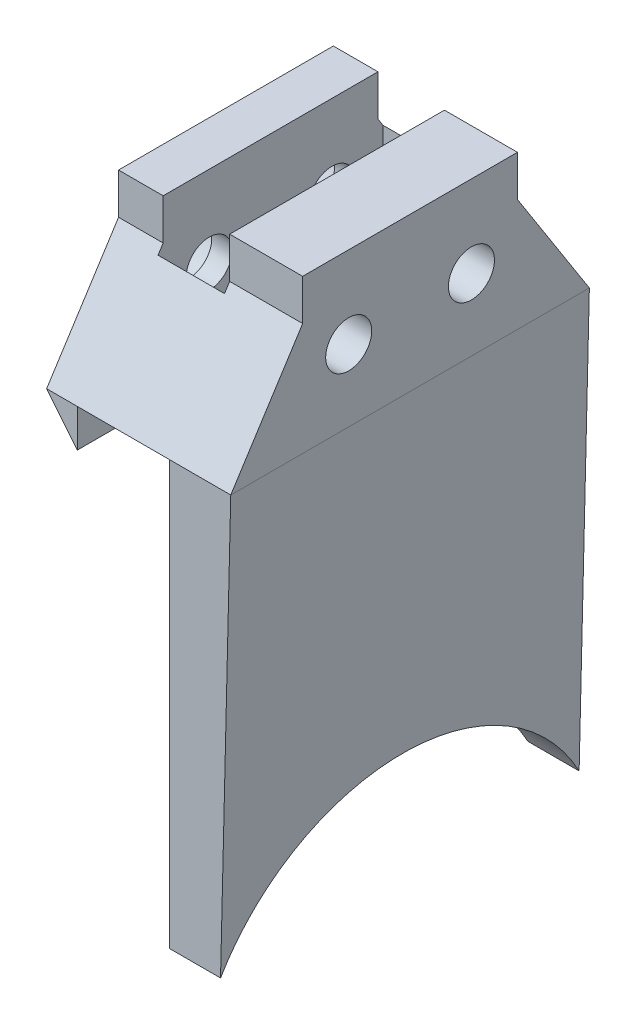
ISO-10303-21;
HEADER;
FILE_DESCRIPTION(('STEP AP214'),'2;1');
FILE_NAME('part.step','',(''),(''),'','','');
FILE_SCHEMA(('AUTOMOTIVE_DESIGN { 1 0 10303 214 1 1 1 1 }'));
ENDSEC;
DATA;
#1=APPLICATION_CONTEXT('core data for automotive mechanical design processes');
#2=APPLICATION_PROTOCOL_DEFINITION('international standard','automotive_design',2000,#1);
#3=PRODUCT_CONTEXT('',#1,'mechanical');
#4=PRODUCT('Part','Part','',(#3));
#5=PRODUCT_RELATED_PRODUCT_CATEGORY('part','',(#4));
#6=PRODUCT_DEFINITION_FORMATION('','',#4);
#7=PRODUCT_DEFINITION_CONTEXT('part definition',#1,'design');
#8=PRODUCT_DEFINITION('design','',#6,#7);
#9=PRODUCT_DEFINITION_SHAPE('','',#8);
#10=(LENGTH_UNIT() NAMED_UNIT(*) SI_UNIT(.MILLI.,.METRE.));
#11=(NAMED_UNIT(*) PLANE_ANGLE_UNIT() SI_UNIT($,.RADIAN.));
#12=(NAMED_UNIT(*) SI_UNIT($,.STERADIAN.) SOLID_ANGLE_UNIT());
#13=UNCERTAINTY_MEASURE_WITH_UNIT(LENGTH_MEASURE(1.E-05),#10,'distance_accuracy_value','');
#14=(GEOMETRIC_REPRESENTATION_CONTEXT(3) GLOBAL_UNCERTAINTY_ASSIGNED_CONTEXT((#13)) GLOBAL_UNIT_ASSIGNED_CONTEXT((#10,
#11,#12)) REPRESENTATION_CONTEXT('',''));
#15=CARTESIAN_POINT('',(0.,0.,0.));
#16=DIRECTION('',(0.,0.,1.));
#17=DIRECTION('',(1.,0.,0.));
#18=AXIS2_PLACEMENT_3D('',#15,#16,#17);
#19=CARTESIAN_POINT('',(6.,-7.5,35.0588586));
#20=DIRECTION('',(0.,1.,0.));
#21=DIRECTION('',(-1.,0.,0.));
#22=AXIS2_PLACEMENT_3D('',#19,#20,#21);
#23=PLANE('',#22);
#24=DIRECTION('',(-1.,0.,0.));
#25=VECTOR('',#24,1.);
#26=CARTESIAN_POINT('',(-1.6375,-7.5,6.5294293));
#27=LINE('',#26,#25);
#28=CARTESIAN_POINT('',(4.8625,-7.5,6.5294293));
#29=VERTEX_POINT('',#28);
#30=CARTESIAN_POINT('',(-1.6375,-7.5,6.5294293));
#31=VERTEX_POINT('',#30);
#32=EDGE_CURVE('E245',#29,#31,#27,.T.);
#33=ORIENTED_EDGE('',*,*,#32,.T.);
#34=DIRECTION('',(0.,0.,1.));
#35=VECTOR('',#34,1.);
#36=CARTESIAN_POINT('',(-1.6375,-7.5,6.5294293));
#37=LINE('',#36,#35);
#38=CARTESIAN_POINT('',(-1.6375,-7.5,28.5294293));
#39=VERTEX_POINT('',#38);
#40=EDGE_CURVE('E237',#31,#39,#37,.T.);
#41=ORIENTED_EDGE('',*,*,#40,.T.);
#42=DIRECTION('',(1.,0.,0.));
#43=VECTOR('',#42,1.);
#44=CARTESIAN_POINT('',(-1.6375,-7.5,28.5294293));
#45=LINE('',#44,#43);
#46=CARTESIAN_POINT('',(4.8625,-7.5,28.5294293));
#47=VERTEX_POINT('',#46);
#48=EDGE_CURVE('E240',#39,#47,#45,.T.);
#49=ORIENTED_EDGE('',*,*,#48,.T.);
#50=DIRECTION('',(0.,0.,-1.));
#51=VECTOR('',#50,1.);
#52=CARTESIAN_POINT('',(4.8625,-7.5,6.5294293));
#53=LINE('',#52,#51);
#54=EDGE_CURVE('E72',#47,#29,#53,.T.);
#55=ORIENTED_EDGE('',*,*,#54,.T.);
#56=EDGE_LOOP('',(#33,#41,#49,#55));
#57=FACE_BOUND('',#56,.T.);
#58=DIRECTION('',(0.,0.,-1.));
#59=VECTOR('',#58,1.);
#60=CARTESIAN_POINT('',(-3.,-7.49999999999995,35.0588586));
#61=LINE('',#60,#59);
#62=CARTESIAN_POINT('',(-3.,-7.5,35.0588586));
#63=VERTEX_POINT('',#62);
#64=CARTESIAN_POINT('',(-3.,-7.49999999999995,0.));
#65=VERTEX_POINT('',#64);
#66=EDGE_CURVE('E202',#63,#65,#61,.T.);
#67=ORIENTED_EDGE('',*,*,#66,.T.);
#68=DIRECTION('',(1.,0.,0.));
#69=VECTOR('',#68,1.);
#70=CARTESIAN_POINT('',(6.,-7.5,0.));
#71=LINE('',#70,#69);
#72=CARTESIAN_POINT('',(6.,-7.49999999999995,0.));
#73=VERTEX_POINT('',#72);
#74=EDGE_CURVE('E338',#65,#73,#71,.T.);
#75=ORIENTED_EDGE('',*,*,#74,.T.);
#76=DIRECTION('',(0.,0.,-1.));
#77=VECTOR('',#76,1.);
#78=CARTESIAN_POINT('',(6.,-7.5,35.0588586));
#79=LINE('',#78,#77);
#80=CARTESIAN_POINT('',(6.,-7.49999999999995,35.0588586));
#81=VERTEX_POINT('',#80);
#82=EDGE_CURVE('E346',#81,#73,#79,.T.);
#83=ORIENTED_EDGE('',*,*,#82,.F.);
#84=DIRECTION('',(1.,0.,0.));
#85=VECTOR('',#84,1.);
#86=CARTESIAN_POINT('',(6.,-7.5,35.0588586));
#87=LINE('',#86,#85);
#88=EDGE_CURVE('E64',#63,#81,#87,.T.);
#89=ORIENTED_EDGE('',*,*,#88,.F.);
#90=EDGE_LOOP('',(#67,#75,#83,#89));
#91=FACE_BOUND('',#90,.T.);
#92=ADVANCED_FACE('F47',(#57,#91),#23,.F.);
#93=CARTESIAN_POINT('',(12.,-0.499999999999999,23.5294293));
#94=DIRECTION('',(-1.,0.,0.));
#95=DIRECTION('',(0.,-1.,0.));
#96=AXIS2_PLACEMENT_3D('',#93,#94,#95);
#97=CYLINDRICAL_SURFACE('',#96,2.25);
#98=CARTESIAN_POINT('',(-1.6375,-0.5,23.5294293));
#99=DIRECTION('',(-1.,0.,0.));
#100=DIRECTION('',(0.,0.,1.));
#101=AXIS2_PLACEMENT_3D('',#98,#99,#100);
#102=CIRCLE('',#101,2.25);
#103=CARTESIAN_POINT('',(-1.6375,-0.5,25.7794293));
#104=VERTEX_POINT('',#103);
#105=EDGE_CURVE('E229',#104,#104,#102,.T.);
#106=ORIENTED_EDGE('',*,*,#105,.F.);
#107=EDGE_LOOP('',(#106));
#108=FACE_BOUND('',#107,.T.);
#109=CARTESIAN_POINT('',(-3.6375,-0.5,23.5294293));
#110=DIRECTION('',(-1.,0.,0.));
#111=DIRECTION('',(0.,-1.,0.));
#112=AXIS2_PLACEMENT_3D('',#109,#110,#111);
#113=CIRCLE('',#112,2.25);
#114=CARTESIAN_POINT('',(-3.6375,-2.75,23.5294293));
#115=VERTEX_POINT('',#114);
#116=EDGE_CURVE('E51',#115,#115,#113,.F.);
#117=ORIENTED_EDGE('',*,*,#116,.F.);
#118=EDGE_LOOP('',(#117));
#119=FACE_BOUND('',#118,.T.);
#120=ADVANCED_FACE('F370',(#108,#119),#97,.F.);
#121=CARTESIAN_POINT('',(12.,-0.499999999999999,11.5294293));
#122=DIRECTION('',(-1.,0.,0.));
#123=DIRECTION('',(0.,-1.,0.));
#124=AXIS2_PLACEMENT_3D('',#121,#122,#123);
#125=CYLINDRICAL_SURFACE('',#124,2.25);
#126=CARTESIAN_POINT('',(-1.6375,-0.5,11.5294293));
#127=DIRECTION('',(-1.,0.,0.));
#128=DIRECTION('',(0.,0.,1.));
#129=AXIS2_PLACEMENT_3D('',#126,#127,#128);
#130=CIRCLE('',#129,2.25);
#131=CARTESIAN_POINT('',(-1.6375,-0.5,13.7794293));
#132=VERTEX_POINT('',#131);
#133=EDGE_CURVE('E233',#132,#132,#130,.T.);
#134=ORIENTED_EDGE('',*,*,#133,.F.);
#135=EDGE_LOOP('',(#134));
#136=FACE_BOUND('',#135,.T.);
#137=CARTESIAN_POINT('',(-3.6375,-0.5,11.5294293));
#138=DIRECTION('',(-1.,0.,0.));
#139=DIRECTION('',(0.,-1.,0.));
#140=AXIS2_PLACEMENT_3D('',#137,#138,#139);
#141=CIRCLE('',#140,2.25);
#142=CARTESIAN_POINT('',(-3.6375,-2.75,11.5294293));
#143=VERTEX_POINT('',#142);
#144=EDGE_CURVE('E213',#143,#143,#141,.F.);
#145=ORIENTED_EDGE('',*,*,#144,.F.);
#146=EDGE_LOOP('',(#145));
#147=FACE_BOUND('',#146,.T.);
#148=ADVANCED_FACE('F372',(#136,#147),#125,.F.);
#149=CARTESIAN_POINT('',(6.,7.5,35.0588586));
#150=DIRECTION('',(0.,-1.,0.));
#151=DIRECTION('',(1.,0.,0.));
#152=AXIS2_PLACEMENT_3D('',#149,#150,#151);
#153=PLANE('',#152);
#154=DIRECTION('',(-1.,0.,0.));
#155=VECTOR('',#154,1.);
#156=CARTESIAN_POINT('',(12.,7.49999999999995,28.0294293));
#157=LINE('',#156,#155);
#158=CARTESIAN_POINT('',(-1.6375,7.5,28.0294293));
#159=VERTEX_POINT('',#158);
#160=CARTESIAN_POINT('',(-6.,7.49999999999995,28.0294293));
#161=VERTEX_POINT('',#160);
#162=EDGE_CURVE('E313',#159,#161,#157,.T.);
#163=ORIENTED_EDGE('',*,*,#162,.F.);
#164=DIRECTION('',(0.,0.,1.));
#165=VECTOR('',#164,1.);
#166=CARTESIAN_POINT('',(-1.6375,7.5,6.5294293));
#167=LINE('',#166,#165);
#168=CARTESIAN_POINT('',(-1.6375,7.5,7.0294293));
#169=VERTEX_POINT('',#168);
#170=EDGE_CURVE('E236',#169,#159,#167,.T.);
#171=ORIENTED_EDGE('',*,*,#170,.F.);
#172=DIRECTION('',(-1.,0.,0.));
#173=VECTOR('',#172,1.);
#174=CARTESIAN_POINT('',(12.,7.49999999999995,7.0294293));
#175=LINE('',#174,#173);
#176=CARTESIAN_POINT('',(-6.,7.5,7.0294293));
#177=VERTEX_POINT('',#176);
#178=EDGE_CURVE('E285',#169,#177,#175,.T.);
#179=ORIENTED_EDGE('',*,*,#178,.T.);
#180=DIRECTION('',(0.,0.,-1.));
#181=VECTOR('',#180,1.);
#182=CARTESIAN_POINT('',(-6.,7.5,35.0588586));
#183=LINE('',#182,#181);
#184=EDGE_CURVE('E340',#161,#177,#183,.T.);
#185=ORIENTED_EDGE('',*,*,#184,.F.);
#186=EDGE_LOOP('',(#163,#171,#179,#185));
#187=FACE_BOUND('',#186,.T.);
#188=ADVANCED_FACE('F379',(#187),#153,.F.);
#189=CARTESIAN_POINT('',(12.,7.49999999999995,28.0294293));
#190=DIRECTION('',(0.,0.,1.));
#191=DIRECTION('',(0.,-1.,0.));
#192=AXIS2_PLACEMENT_3D('',#189,#190,#191);
#193=PLANE('',#192);
#194=DIRECTION('',(0.,-1.,0.));
#195=VECTOR('',#194,1.);
#196=CARTESIAN_POINT('',(-1.6375,7.49999999999995,28.0294293));
#197=LINE('',#196,#195);
#198=CARTESIAN_POINT('',(-1.6375,3.49999999999995,28.0294293));
#199=VERTEX_POINT('',#198);
#200=EDGE_CURVE('E271',#159,#199,#197,.T.);
#201=ORIENTED_EDGE('',*,*,#200,.F.);
#202=ORIENTED_EDGE('',*,*,#162,.T.);
#203=DIRECTION('',(0.,1.,0.));
#204=VECTOR('',#203,1.);
#205=CARTESIAN_POINT('',(-6.,7.49999999999995,28.0294293));
#206=LINE('',#205,#204);
#207=CARTESIAN_POINT('',(-6.,3.49999999999995,28.0294293));
#208=VERTEX_POINT('',#207);
#209=EDGE_CURVE('E273',#208,#161,#206,.T.);
#210=ORIENTED_EDGE('',*,*,#209,.F.);
#211=DIRECTION('',(-1.,0.,0.));
#212=VECTOR('',#211,1.);
#213=CARTESIAN_POINT('',(12.,3.49999999999995,28.0294293));
#214=LINE('',#213,#212);
#215=EDGE_CURVE('E306',#199,#208,#214,.T.);
#216=ORIENTED_EDGE('',*,*,#215,.F.);
#217=EDGE_LOOP('',(#201,#202,#210,#216));
#218=FACE_BOUND('',#217,.T.);
#219=ADVANCED_FACE('F478',(#218),#193,.T.);
#220=CARTESIAN_POINT('',(12.,7.49999999999995,7.0294293));
#221=DIRECTION('',(0.,0.,-1.));
#222=DIRECTION('',(0.,1.,0.));
#223=AXIS2_PLACEMENT_3D('',#220,#221,#222);
#224=PLANE('',#223);
#225=DIRECTION('',(0.,1.,0.));
#226=VECTOR('',#225,1.);
#227=CARTESIAN_POINT('',(-1.6375,7.49999999999995,7.0294293));
#228=LINE('',#227,#226);
#229=CARTESIAN_POINT('',(-1.6375,3.49999999999995,7.0294293));
#230=VERTEX_POINT('',#229);
#231=EDGE_CURVE('E267',#230,#169,#228,.T.);
#232=ORIENTED_EDGE('',*,*,#231,.F.);
#233=DIRECTION('',(-1.,0.,0.));
#234=VECTOR('',#233,1.);
#235=CARTESIAN_POINT('',(12.,3.49999999999995,7.0294293));
#236=LINE('',#235,#234);
#237=CARTESIAN_POINT('',(-6.,3.49999999999995,7.0294293));
#238=VERTEX_POINT('',#237);
#239=EDGE_CURVE('E292',#230,#238,#236,.T.);
#240=ORIENTED_EDGE('',*,*,#239,.T.);
#241=DIRECTION('',(0.,-1.,0.));
#242=VECTOR('',#241,1.);
#243=CARTESIAN_POINT('',(-6.,7.49999999999995,7.0294293));
#244=LINE('',#243,#242);
#245=EDGE_CURVE('E274',#177,#238,#244,.T.);
#246=ORIENTED_EDGE('',*,*,#245,.F.);
#247=ORIENTED_EDGE('',*,*,#178,.F.);
#248=EDGE_LOOP('',(#232,#240,#246,#247));
#249=FACE_BOUND('',#248,.T.);
#250=ADVANCED_FACE('F467',(#249),#224,.T.);
#251=CARTESIAN_POINT('',(0.,0.,35.0588586));
#252=DIRECTION('',(0.,0.,-1.));
#253=DIRECTION('',(-1.,0.,0.));
#254=AXIS2_PLACEMENT_3D('',#251,#252,#253);
#255=PLANE('',#254);
#256=DIRECTION('',(-1.,0.,0.));
#257=VECTOR('',#256,1.);
#258=CARTESIAN_POINT('',(12.,-7.49999999999995,35.0588586));
#259=LINE('',#258,#257);
#260=CARTESIAN_POINT('',(12.,-7.49999999999995,35.0588586));
#261=VERTEX_POINT('',#260);
#262=EDGE_CURVE('E310',#261,#81,#259,.T.);
#263=ORIENTED_EDGE('',*,*,#262,.T.);
#264=DIRECTION('',(0.,-1.,0.));
#265=VECTOR('',#264,1.);
#266=CARTESIAN_POINT('',(6.,7.5,35.0588586));
#267=LINE('',#266,#265);
#268=CARTESIAN_POINT('',(6.00000000000001,-48.8959251,35.0588586));
#269=VERTEX_POINT('',#268);
#270=EDGE_CURVE('E330',#81,#269,#267,.T.);
#271=ORIENTED_EDGE('',*,*,#270,.T.);
#272=DIRECTION('',(-1.,0.,0.));
#273=VECTOR('',#272,1.);
#274=CARTESIAN_POINT('',(12.,-48.8959251,35.0588586));
#275=LINE('',#274,#273);
#276=CARTESIAN_POINT('',(11.,-48.8959251,35.0588586));
#277=VERTEX_POINT('',#276);
#278=EDGE_CURVE('E336',#277,#269,#275,.T.);
#279=ORIENTED_EDGE('',*,*,#278,.F.);
#280=DIRECTION('',(-0.0241499216576646,-0.999708348111552,0.));
#281=VECTOR('',#280,1.);
#282=CARTESIAN_POINT('',(12.1740729625627,-0.294088679819423,35.0588586));
#283=LINE('',#282,#281);
#284=EDGE_CURVE('E318',#261,#277,#283,.T.);
#285=ORIENTED_EDGE('',*,*,#284,.F.);
#286=EDGE_LOOP('',(#263,#271,#279,#285));
#287=FACE_BOUND('',#286,.T.);
#288=ADVANCED_FACE('F442',(#287),#255,.F.);
#289=CARTESIAN_POINT('',(0.,0.,0.));
#290=DIRECTION('',(0.,0.,-1.));
#291=DIRECTION('',(-1.,0.,0.));
#292=AXIS2_PLACEMENT_3D('',#289,#290,#291);
#293=PLANE('',#292);
#294=DIRECTION('',(0.,1.,0.));
#295=VECTOR('',#294,1.);
#296=CARTESIAN_POINT('',(6.,7.5,0.));
#297=LINE('',#296,#295);
#298=CARTESIAN_POINT('',(6.00000000000001,-48.8959251,0.));
#299=VERTEX_POINT('',#298);
#300=EDGE_CURVE('E322',#299,#73,#297,.T.);
#301=ORIENTED_EDGE('',*,*,#300,.T.);
#302=DIRECTION('',(-1.,0.,0.));
#303=VECTOR('',#302,1.);
#304=CARTESIAN_POINT('',(12.,-7.49999999999995,0.));
#305=LINE('',#304,#303);
#306=CARTESIAN_POINT('',(12.,-7.49999999999995,0.));
#307=VERTEX_POINT('',#306);
#308=EDGE_CURVE('E289',#307,#73,#305,.T.);
#309=ORIENTED_EDGE('',*,*,#308,.F.);
#310=DIRECTION('',(-0.0241499216576646,-0.999708348111552,0.));
#311=VECTOR('',#310,1.);
#312=CARTESIAN_POINT('',(12.1740729625627,-0.294088679819423,0.));
#313=LINE('',#312,#311);
#314=CARTESIAN_POINT('',(11.,-48.8959251,0.));
#315=VERTEX_POINT('',#314);
#316=EDGE_CURVE('E296',#307,#315,#313,.T.);
#317=ORIENTED_EDGE('',*,*,#316,.T.);
#318=DIRECTION('',(-1.,0.,0.));
#319=VECTOR('',#318,1.);
#320=CARTESIAN_POINT('',(12.,-48.8959251,0.));
#321=LINE('',#320,#319);
#322=EDGE_CURVE('E326',#315,#299,#321,.T.);
#323=ORIENTED_EDGE('',*,*,#322,.T.);
#324=EDGE_LOOP('',(#301,#309,#317,#323));
#325=FACE_BOUND('',#324,.T.);
#326=ADVANCED_FACE('F457',(#325),#293,.T.);
#327=CARTESIAN_POINT('',(12.,-58.5250012974502,17.5294293));
#328=DIRECTION('',(1.,0.,0.));
#329=DIRECTION('',(0.,1.,0.));
#330=AXIS2_PLACEMENT_3D('',#327,#328,#329);
#331=PLANE('',#330);
#332=CARTESIAN_POINT('',(12.,-0.499999999999999,11.5294293));
#333=DIRECTION('',(-1.,0.,0.));
#334=DIRECTION('',(0.,-1.,0.));
#335=AXIS2_PLACEMENT_3D('',#332,#333,#334);
#336=CIRCLE('',#335,2.25);
#337=CARTESIAN_POINT('',(12.,-2.75,11.5294293));
#338=VERTEX_POINT('',#337);
#339=EDGE_CURVE('E222',#338,#338,#336,.T.);
#340=ORIENTED_EDGE('',*,*,#339,.T.);
#341=EDGE_LOOP('',(#340));
#342=FACE_BOUND('',#341,.T.);
#343=CARTESIAN_POINT('',(12.,-0.499999999999999,23.5294293));
#344=DIRECTION('',(-1.,0.,0.));
#345=DIRECTION('',(0.,-1.,0.));
#346=AXIS2_PLACEMENT_3D('',#343,#344,#345);
#347=CIRCLE('',#346,2.25);
#348=CARTESIAN_POINT('',(12.,-2.75,23.5294293));
#349=VERTEX_POINT('',#348);
#350=EDGE_CURVE('E226',#349,#349,#347,.T.);
#351=ORIENTED_EDGE('',*,*,#350,.T.);
#352=EDGE_LOOP('',(#351));
#353=FACE_BOUND('',#352,.T.);
#354=DIRECTION('',(0.,-0.842638856504142,-0.538479115202615));
#355=VECTOR('',#354,1.);
#356=CARTESIAN_POINT('',(12.,3.49999999999995,7.0294293));
#357=LINE('',#356,#355);
#358=CARTESIAN_POINT('',(12.,3.49999999999995,7.0294293));
#359=VERTEX_POINT('',#358);
#360=EDGE_CURVE('E283',#359,#307,#357,.T.);
#361=ORIENTED_EDGE('',*,*,#360,.F.);
#362=DIRECTION('',(0.,-1.,0.));
#363=VECTOR('',#362,1.);
#364=CARTESIAN_POINT('',(12.,7.49999999999995,7.0294293));
#365=LINE('',#364,#363);
#366=CARTESIAN_POINT('',(12.,7.49999999999995,7.0294293));
#367=VERTEX_POINT('',#366);
#368=EDGE_CURVE('E281',#367,#359,#365,.T.);
#369=ORIENTED_EDGE('',*,*,#368,.F.);
#370=DIRECTION('',(0.,0.,1.));
#371=VECTOR('',#370,1.);
#372=CARTESIAN_POINT('',(12.,7.5,0.));
#373=LINE('',#372,#371);
#374=CARTESIAN_POINT('',(12.,7.5,28.0294293));
#375=VERTEX_POINT('',#374);
#376=EDGE_CURVE('E323',#367,#375,#373,.T.);
#377=ORIENTED_EDGE('',*,*,#376,.T.);
#378=DIRECTION('',(0.,1.,0.));
#379=VECTOR('',#378,1.);
#380=CARTESIAN_POINT('',(12.,7.49999999999995,28.0294293));
#381=LINE('',#380,#379);
#382=CARTESIAN_POINT('',(12.,3.49999999999995,28.0294293));
#383=VERTEX_POINT('',#382);
#384=EDGE_CURVE('E302',#383,#375,#381,.T.);
#385=ORIENTED_EDGE('',*,*,#384,.F.);
#386=DIRECTION('',(0.,0.842638856504142,-0.538479115202615));
#387=VECTOR('',#386,1.);
#388=CARTESIAN_POINT('',(12.,3.49999999999995,28.0294293));
#389=LINE('',#388,#387);
#390=EDGE_CURVE('E304',#261,#383,#389,.T.);
#391=ORIENTED_EDGE('',*,*,#390,.F.);
#392=DIRECTION('',(0.,0.,-1.));
#393=VECTOR('',#392,1.);
#394=CARTESIAN_POINT('',(12.,-7.50000000000031,17.5294293));
#395=LINE('',#394,#393);
#396=EDGE_CURVE('E351',#261,#307,#395,.T.);
#397=ORIENTED_EDGE('',*,*,#396,.T.);
#398=EDGE_LOOP('',(#361,#369,#377,#385,#391,#397));
#399=FACE_BOUND('',#398,.T.);
#400=ADVANCED_FACE('F420',(#342,#353,#399),#331,.T.);
#401=CARTESIAN_POINT('',(-6.,7.5,35.0588586));
#402=DIRECTION('',(1.,0.,0.));
#403=DIRECTION('',(0.,1.,0.));
#404=AXIS2_PLACEMENT_3D('',#401,#402,#403);
#405=PLANE('',#404);
#406=CARTESIAN_POINT('',(-6.,-0.500000000000001,11.5294293));
#407=DIRECTION('',(-1.,0.,0.));
#408=DIRECTION('',(0.,-1.,0.));
#409=AXIS2_PLACEMENT_3D('',#406,#407,#408);
#410=CIRCLE('',#409,3.75);
#411=CARTESIAN_POINT('',(-6.,-4.25,11.5294293));
#412=VERTEX_POINT('',#411);
#413=EDGE_CURVE('E214',#412,#412,#410,.T.);
#414=ORIENTED_EDGE('',*,*,#413,.F.);
#415=EDGE_LOOP('',(#414));
#416=FACE_BOUND('',#415,.T.);
#417=CARTESIAN_POINT('',(-6.,-0.500000000000001,23.5294293));
#418=DIRECTION('',(-1.,0.,0.));
#419=DIRECTION('',(0.,-1.,0.));
#420=AXIS2_PLACEMENT_3D('',#417,#418,#419);
#421=CIRCLE('',#420,3.75);
#422=CARTESIAN_POINT('',(-6.,-4.25,23.5294293));
#423=VERTEX_POINT('',#422);
#424=EDGE_CURVE('E201',#423,#423,#421,.T.);
#425=ORIENTED_EDGE('',*,*,#424,.F.);
#426=EDGE_LOOP('',(#425));
#427=FACE_BOUND('',#426,.T.);
#428=ORIENTED_EDGE('',*,*,#245,.T.);
#429=DIRECTION('',(0.,-0.842638856504142,-0.538479115202615));
#430=VECTOR('',#429,1.);
#431=CARTESIAN_POINT('',(-6.,3.49999999999995,7.0294293));
#432=LINE('',#431,#430);
#433=CARTESIAN_POINT('',(-6.,-7.49999999999995,0.));
#434=VERTEX_POINT('',#433);
#435=EDGE_CURVE('E277',#238,#434,#432,.T.);
#436=ORIENTED_EDGE('',*,*,#435,.T.);
#437=DIRECTION('',(0.,0.,-1.));
#438=VECTOR('',#437,1.);
#439=CARTESIAN_POINT('',(-6.,-7.5,35.0588586));
#440=LINE('',#439,#438);
#441=CARTESIAN_POINT('',(-6.,-7.49999999999995,35.0588586));
#442=VERTEX_POINT('',#441);
#443=EDGE_CURVE('E349',#442,#434,#440,.T.);
#444=ORIENTED_EDGE('',*,*,#443,.F.);
#445=DIRECTION('',(0.,0.842638856504142,-0.538479115202615));
#446=VECTOR('',#445,1.);
#447=CARTESIAN_POINT('',(-6.,3.49999999999995,28.0294293));
#448=LINE('',#447,#446);
#449=EDGE_CURVE('E299',#442,#208,#448,.T.);
#450=ORIENTED_EDGE('',*,*,#449,.T.);
#451=ORIENTED_EDGE('',*,*,#209,.T.);
#452=ORIENTED_EDGE('',*,*,#184,.T.);
#453=EDGE_LOOP('',(#428,#436,#444,#450,#451,#452));
#454=FACE_BOUND('',#453,.T.);
#455=ADVANCED_FACE('F49',(#416,#427,#454),#405,.F.);
#456=CARTESIAN_POINT('',(4.8625,7.5,7.0294293));
#457=VERTEX_POINT('',#456);
#458=EDGE_CURVE('E286',#367,#457,#175,.T.);
#459=ORIENTED_EDGE('',*,*,#458,.T.);
#460=DIRECTION('',(0.,0.,-1.));
#461=VECTOR('',#460,1.);
#462=CARTESIAN_POINT('',(4.8625,7.5,6.5294293));
#463=LINE('',#462,#461);
#464=CARTESIAN_POINT('',(4.8625,7.5,28.0294293));
#465=VERTEX_POINT('',#464);
#466=EDGE_CURVE('E241',#465,#457,#463,.T.);
#467=ORIENTED_EDGE('',*,*,#466,.F.);
#468=EDGE_CURVE('E278',#375,#465,#157,.T.);
#469=ORIENTED_EDGE('',*,*,#468,.F.);
#470=ORIENTED_EDGE('',*,*,#376,.F.);
#471=EDGE_LOOP('',(#459,#467,#469,#470));
#472=FACE_BOUND('',#471,.T.);
#473=ADVANCED_FACE('F413',(#472),#153,.F.);
#474=CARTESIAN_POINT('',(12.,-58.5250012974502,17.5294293));
#475=DIRECTION('',(-1.,0.,0.));
#476=DIRECTION('',(0.,-1.,0.));
#477=AXIS2_PLACEMENT_3D('',#474,#475,#476);
#478=CYLINDRICAL_SURFACE('',#477,20.);
#479=CARTESIAN_POINT('',(10.7673907232611,-58.5250012974502,17.5294293));
#480=DIRECTION('',(0.999708348111552,-0.0241499216576646,0.));
#481=DIRECTION('',(-0.0241499216576646,-0.999708348111552,0.));
#482=AXIS2_PLACEMENT_3D('',#479,#480,#481);
#483=ELLIPSE('',#482,20.0058347394817,20.);
#484=EDGE_CURVE('E320',#277,#315,#483,.F.);
#485=ORIENTED_EDGE('',*,*,#484,.F.);
#486=ORIENTED_EDGE('',*,*,#278,.T.);
#487=CARTESIAN_POINT('',(6.00000000000001,-58.5250012974502,17.5294293));
#488=DIRECTION('',(-1.,0.,0.));
#489=DIRECTION('',(0.,1.,0.));
#490=AXIS2_PLACEMENT_3D('',#487,#488,#489);
#491=CIRCLE('',#490,20.);
#492=EDGE_CURVE('E327',#269,#299,#491,.T.);
#493=ORIENTED_EDGE('',*,*,#492,.T.);
#494=ORIENTED_EDGE('',*,*,#322,.F.);
#495=EDGE_LOOP('',(#485,#486,#493,#494));
#496=FACE_BOUND('',#495,.T.);
#497=ADVANCED_FACE('F452',(#496),#478,.F.);
#498=CARTESIAN_POINT('',(6.00000000000001,-58.5250012974502,17.5294293));
#499=DIRECTION('',(1.,0.,0.));
#500=DIRECTION('',(0.,1.,0.));
#501=AXIS2_PLACEMENT_3D('',#498,#499,#500);
#502=PLANE('',#501);
#503=ORIENTED_EDGE('',*,*,#270,.F.);
#504=ORIENTED_EDGE('',*,*,#82,.T.);
#505=ORIENTED_EDGE('',*,*,#300,.F.);
#506=ORIENTED_EDGE('',*,*,#492,.F.);
#507=EDGE_LOOP('',(#503,#504,#505,#506));
#508=FACE_BOUND('',#507,.T.);
#509=ADVANCED_FACE('F448',(#508),#502,.F.);
#510=CARTESIAN_POINT('',(12.1740729625627,-0.294088679819423,0.));
#511=DIRECTION('',(0.999708348111552,-0.0241499216576646,0.));
#512=DIRECTION('',(0.0241499216576646,0.999708348111552,0.));
#513=AXIS2_PLACEMENT_3D('',#510,#511,#512);
#514=PLANE('',#513);
#515=ORIENTED_EDGE('',*,*,#484,.T.);
#516=ORIENTED_EDGE('',*,*,#316,.F.);
#517=ORIENTED_EDGE('',*,*,#396,.F.);
#518=ORIENTED_EDGE('',*,*,#284,.T.);
#519=EDGE_LOOP('',(#515,#516,#517,#518));
#520=FACE_BOUND('',#519,.T.);
#521=ADVANCED_FACE('F455',(#520),#514,.T.);
#522=DIRECTION('',(0.,1.,0.));
#523=VECTOR('',#522,1.);
#524=CARTESIAN_POINT('',(4.8625,7.49999999999995,28.0294293));
#525=LINE('',#524,#523);
#526=CARTESIAN_POINT('',(4.8625,3.49999999999995,28.0294293));
#527=VERTEX_POINT('',#526);
#528=EDGE_CURVE('E265',#527,#465,#525,.T.);
#529=ORIENTED_EDGE('',*,*,#528,.F.);
#530=EDGE_CURVE('E307',#383,#527,#214,.T.);
#531=ORIENTED_EDGE('',*,*,#530,.F.);
#532=ORIENTED_EDGE('',*,*,#384,.T.);
#533=ORIENTED_EDGE('',*,*,#468,.T.);
#534=EDGE_LOOP('',(#529,#531,#532,#533));
#535=FACE_BOUND('',#534,.T.);
#536=ADVANCED_FACE('F415',(#535),#193,.T.);
#537=CARTESIAN_POINT('',(12.,3.49999999999995,28.0294293));
#538=DIRECTION('',(0.,0.538479115202615,0.842638856504142));
#539=DIRECTION('',(0.,-0.842638856504142,0.538479115202615));
#540=AXIS2_PLACEMENT_3D('',#537,#538,#539);
#541=PLANE('',#540);
#542=DIRECTION('',(0.,-0.842638856504142,0.538479115202615));
#543=VECTOR('',#542,1.);
#544=CARTESIAN_POINT('',(-1.6375,3.49999999999995,28.0294293));
#545=LINE('',#544,#543);
#546=CARTESIAN_POINT('',(-1.6375,2.71757517356346,28.5294293));
#547=VERTEX_POINT('',#546);
#548=EDGE_CURVE('E269',#199,#547,#545,.T.);
#549=ORIENTED_EDGE('',*,*,#548,.F.);
#550=ORIENTED_EDGE('',*,*,#215,.T.);
#551=ORIENTED_EDGE('',*,*,#449,.F.);
#552=EDGE_CURVE('E188',#442,#63,#87,.T.);
#553=ORIENTED_EDGE('',*,*,#552,.T.);
#554=ORIENTED_EDGE('',*,*,#88,.T.);
#555=ORIENTED_EDGE('',*,*,#262,.F.);
#556=ORIENTED_EDGE('',*,*,#390,.T.);
#557=ORIENTED_EDGE('',*,*,#530,.T.);
#558=DIRECTION('',(0.,0.842638856504142,-0.538479115202615));
#559=VECTOR('',#558,1.);
#560=CARTESIAN_POINT('',(4.8625,3.49999999999995,28.0294293));
#561=LINE('',#560,#559);
#562=CARTESIAN_POINT('',(4.8625,2.71757517356346,28.5294293));
#563=VERTEX_POINT('',#562);
#564=EDGE_CURVE('E263',#563,#527,#561,.T.);
#565=ORIENTED_EDGE('',*,*,#564,.F.);
#566=DIRECTION('',(1.,0.,0.));
#567=VECTOR('',#566,1.);
#568=CARTESIAN_POINT('',(12.,2.71757517356346,28.5294293));
#569=LINE('',#568,#567);
#570=EDGE_CURVE('E11',#547,#563,#569,.T.);
#571=ORIENTED_EDGE('',*,*,#570,.F.);
#572=EDGE_LOOP('',(#549,#550,#551,#553,#554,#555,#556,#557,#565,#571));
#573=FACE_BOUND('',#572,.T.);
#574=ADVANCED_FACE('F439',(#573),#541,.T.);
#575=DIRECTION('',(0.,-1.,0.));
#576=VECTOR('',#575,1.);
#577=CARTESIAN_POINT('',(4.8625,7.49999999999995,7.0294293));
#578=LINE('',#577,#576);
#579=CARTESIAN_POINT('',(4.8625,3.49999999999995,7.0294293));
#580=VERTEX_POINT('',#579);
#581=EDGE_CURVE('E254',#457,#580,#578,.T.);
#582=ORIENTED_EDGE('',*,*,#581,.F.);
#583=ORIENTED_EDGE('',*,*,#458,.F.);
#584=ORIENTED_EDGE('',*,*,#368,.T.);
#585=EDGE_CURVE('E293',#359,#580,#236,.T.);
#586=ORIENTED_EDGE('',*,*,#585,.T.);
#587=EDGE_LOOP('',(#582,#583,#584,#586));
#588=FACE_BOUND('',#587,.T.);
#589=ADVANCED_FACE('F425',(#588),#224,.T.);
#590=CARTESIAN_POINT('',(12.,3.49999999999995,7.0294293));
#591=DIRECTION('',(0.,0.538479115202615,-0.842638856504142));
#592=DIRECTION('',(0.,0.842638856504142,0.538479115202615));
#593=AXIS2_PLACEMENT_3D('',#590,#591,#592);
#594=PLANE('',#593);
#595=DIRECTION('',(0.,0.842638856504142,0.538479115202615));
#596=VECTOR('',#595,1.);
#597=CARTESIAN_POINT('',(-1.6375,3.49999999999995,7.0294293));
#598=LINE('',#597,#596);
#599=CARTESIAN_POINT('',(-1.6375,2.71757517356348,6.5294293));
#600=VERTEX_POINT('',#599);
#601=EDGE_CURVE('E56',#600,#230,#598,.T.);
#602=ORIENTED_EDGE('',*,*,#601,.F.);
#603=DIRECTION('',(-1.,0.,0.));
#604=VECTOR('',#603,1.);
#605=CARTESIAN_POINT('',(12.,2.71757517356348,6.5294293));
#606=LINE('',#605,#604);
#607=CARTESIAN_POINT('',(4.8625,2.71757517356348,6.5294293));
#608=VERTEX_POINT('',#607);
#609=EDGE_CURVE('E356',#608,#600,#606,.T.);
#610=ORIENTED_EDGE('',*,*,#609,.F.);
#611=DIRECTION('',(0.,-0.842638856504142,-0.538479115202615));
#612=VECTOR('',#611,1.);
#613=CARTESIAN_POINT('',(4.8625,3.49999999999995,7.0294293));
#614=LINE('',#613,#612);
#615=EDGE_CURVE('E354',#580,#608,#614,.T.);
#616=ORIENTED_EDGE('',*,*,#615,.F.);
#617=ORIENTED_EDGE('',*,*,#585,.F.);
#618=ORIENTED_EDGE('',*,*,#360,.T.);
#619=ORIENTED_EDGE('',*,*,#308,.T.);
#620=ORIENTED_EDGE('',*,*,#74,.F.);
#621=EDGE_CURVE('E341',#434,#65,#71,.T.);
#622=ORIENTED_EDGE('',*,*,#621,.F.);
#623=ORIENTED_EDGE('',*,*,#435,.F.);
#624=ORIENTED_EDGE('',*,*,#239,.F.);
#625=EDGE_LOOP('',(#602,#610,#616,#617,#618,#619,#620,#622,#623,#624));
#626=FACE_BOUND('',#625,.T.);
#627=ADVANCED_FACE('F429',(#626),#594,.T.);
#628=CARTESIAN_POINT('',(-1.6375,-7.5,6.5294293));
#629=DIRECTION('',(-1.,0.,0.));
#630=DIRECTION('',(0.,0.,1.));
#631=AXIS2_PLACEMENT_3D('',#628,#629,#630);
#632=PLANE('',#631);
#633=ORIENTED_EDGE('',*,*,#133,.T.);
#634=EDGE_LOOP('',(#633));
#635=FACE_BOUND('',#634,.T.);
#636=ORIENTED_EDGE('',*,*,#105,.T.);
#637=EDGE_LOOP('',(#636));
#638=FACE_BOUND('',#637,.T.);
#639=ORIENTED_EDGE('',*,*,#200,.T.);
#640=ORIENTED_EDGE('',*,*,#548,.T.);
#641=DIRECTION('',(0.,1.,0.));
#642=VECTOR('',#641,1.);
#643=CARTESIAN_POINT('',(-1.6375,-7.5,28.5294293));
#644=LINE('',#643,#642);
#645=EDGE_CURVE('E248',#39,#547,#644,.T.);
#646=ORIENTED_EDGE('',*,*,#645,.F.);
#647=ORIENTED_EDGE('',*,*,#40,.F.);
#648=DIRECTION('',(0.,1.,0.));
#649=VECTOR('',#648,1.);
#650=CARTESIAN_POINT('',(-1.6375,-7.5,6.5294293));
#651=LINE('',#650,#649);
#652=EDGE_CURVE('E251',#31,#600,#651,.T.);
#653=ORIENTED_EDGE('',*,*,#652,.T.);
#654=ORIENTED_EDGE('',*,*,#601,.T.);
#655=ORIENTED_EDGE('',*,*,#231,.T.);
#656=ORIENTED_EDGE('',*,*,#170,.T.);
#657=EDGE_LOOP('',(#639,#640,#646,#647,#653,#654,#655,#656));
#658=FACE_BOUND('',#657,.T.);
#659=ADVANCED_FACE('F471',(#635,#638,#658),#632,.F.);
#660=CARTESIAN_POINT('',(-1.6375,-7.5,6.5294293));
#661=DIRECTION('',(0.,0.,-1.));
#662=DIRECTION('',(-1.,0.,0.));
#663=AXIS2_PLACEMENT_3D('',#660,#661,#662);
#664=PLANE('',#663);
#665=ORIENTED_EDGE('',*,*,#609,.T.);
#666=ORIENTED_EDGE('',*,*,#652,.F.);
#667=ORIENTED_EDGE('',*,*,#32,.F.);
#668=DIRECTION('',(0.,1.,0.));
#669=VECTOR('',#668,1.);
#670=CARTESIAN_POINT('',(4.8625,-7.5,6.5294293));
#671=LINE('',#670,#669);
#672=EDGE_CURVE('E255',#29,#608,#671,.T.);
#673=ORIENTED_EDGE('',*,*,#672,.T.);
#674=EDGE_LOOP('',(#665,#666,#667,#673));
#675=FACE_BOUND('',#674,.T.);
#676=ADVANCED_FACE('F402',(#675),#664,.F.);
#677=CARTESIAN_POINT('',(4.8625,-7.5,6.5294293));
#678=DIRECTION('',(1.,0.,0.));
#679=DIRECTION('',(0.,0.,-1.));
#680=AXIS2_PLACEMENT_3D('',#677,#678,#679);
#681=PLANE('',#680);
#682=CARTESIAN_POINT('',(4.8625,-0.499999999999999,11.5294293));
#683=DIRECTION('',(1.,0.,0.));
#684=DIRECTION('',(0.,0.,-1.));
#685=AXIS2_PLACEMENT_3D('',#682,#683,#684);
#686=CIRCLE('',#685,2.25);
#687=CARTESIAN_POINT('',(4.8625,-0.499999999999999,9.2794293));
#688=VERTEX_POINT('',#687);
#689=EDGE_CURVE('E232',#688,#688,#686,.T.);
#690=ORIENTED_EDGE('',*,*,#689,.T.);
#691=EDGE_LOOP('',(#690));
#692=FACE_BOUND('',#691,.T.);
#693=CARTESIAN_POINT('',(4.8625,-0.499999999999999,23.5294293));
#694=DIRECTION('',(1.,0.,0.));
#695=DIRECTION('',(0.,0.,-1.));
#696=AXIS2_PLACEMENT_3D('',#693,#694,#695);
#697=CIRCLE('',#696,2.25);
#698=CARTESIAN_POINT('',(4.8625,-0.499999999999999,21.2794293));
#699=VERTEX_POINT('',#698);
#700=EDGE_CURVE('E225',#699,#699,#697,.T.);
#701=ORIENTED_EDGE('',*,*,#700,.T.);
#702=EDGE_LOOP('',(#701));
#703=FACE_BOUND('',#702,.T.);
#704=ORIENTED_EDGE('',*,*,#528,.T.);
#705=ORIENTED_EDGE('',*,*,#466,.T.);
#706=ORIENTED_EDGE('',*,*,#581,.T.);
#707=ORIENTED_EDGE('',*,*,#615,.T.);
#708=ORIENTED_EDGE('',*,*,#672,.F.);
#709=ORIENTED_EDGE('',*,*,#54,.F.);
#710=DIRECTION('',(0.,1.,0.));
#711=VECTOR('',#710,1.);
#712=CARTESIAN_POINT('',(4.8625,-7.5,28.5294293));
#713=LINE('',#712,#711);
#714=EDGE_CURVE('E258',#47,#563,#713,.T.);
#715=ORIENTED_EDGE('',*,*,#714,.T.);
#716=ORIENTED_EDGE('',*,*,#564,.T.);
#717=EDGE_LOOP('',(#704,#705,#706,#707,#708,#709,#715,#716));
#718=FACE_BOUND('',#717,.T.);
#719=ADVANCED_FACE('F394',(#692,#703,#718),#681,.F.);
#720=CARTESIAN_POINT('',(-1.6375,-7.5,28.5294293));
#721=DIRECTION('',(0.,0.,1.));
#722=DIRECTION('',(1.,0.,0.));
#723=AXIS2_PLACEMENT_3D('',#720,#721,#722);
#724=PLANE('',#723);
#725=ORIENTED_EDGE('',*,*,#570,.T.);
#726=ORIENTED_EDGE('',*,*,#714,.F.);
#727=ORIENTED_EDGE('',*,*,#48,.F.);
#728=ORIENTED_EDGE('',*,*,#645,.T.);
#729=EDGE_LOOP('',(#725,#726,#727,#728));
#730=FACE_BOUND('',#729,.T.);
#731=ADVANCED_FACE('F387',(#730),#724,.F.);
#732=ORIENTED_EDGE('',*,*,#350,.F.);
#733=EDGE_LOOP('',(#732));
#734=FACE_BOUND('',#733,.T.);
#735=ORIENTED_EDGE('',*,*,#700,.F.);
#736=EDGE_LOOP('',(#735));
#737=FACE_BOUND('',#736,.T.);
#738=ADVANCED_FACE('F375',(#734,#737),#97,.F.);
#739=ORIENTED_EDGE('',*,*,#339,.F.);
#740=EDGE_LOOP('',(#739));
#741=FACE_BOUND('',#740,.T.);
#742=ORIENTED_EDGE('',*,*,#689,.F.);
#743=EDGE_LOOP('',(#742));
#744=FACE_BOUND('',#743,.T.);
#745=ADVANCED_FACE('F382',(#741,#744),#125,.F.);
#746=CARTESIAN_POINT('',(-3.6375,-0.5,11.5294293));
#747=DIRECTION('',(-1.,0.,0.));
#748=DIRECTION('',(0.,-1.,0.));
#749=AXIS2_PLACEMENT_3D('',#746,#747,#748);
#750=PLANE('',#749);
#751=CARTESIAN_POINT('',(-3.6375,-0.5,11.5294293));
#752=DIRECTION('',(-1.,0.,0.));
#753=DIRECTION('',(0.,-1.,0.));
#754=AXIS2_PLACEMENT_3D('',#751,#752,#753);
#755=CIRCLE('',#754,3.75);
#756=CARTESIAN_POINT('',(-3.6375,-4.25,11.5294293));
#757=VERTEX_POINT('',#756);
#758=EDGE_CURVE('E210',#757,#757,#755,.T.);
#759=ORIENTED_EDGE('',*,*,#758,.T.);
#760=EDGE_LOOP('',(#759));
#761=FACE_BOUND('',#760,.T.);
#762=ORIENTED_EDGE('',*,*,#144,.T.);
#763=EDGE_LOOP('',(#762));
#764=FACE_BOUND('',#763,.T.);
#765=ADVANCED_FACE('F392',(#761,#764),#750,.T.);
#766=CARTESIAN_POINT('',(-3.6375,-0.5,11.5294293));
#767=DIRECTION('',(-1.,0.,0.));
#768=DIRECTION('',(0.,-1.,0.));
#769=AXIS2_PLACEMENT_3D('',#766,#767,#768);
#770=CYLINDRICAL_SURFACE('',#769,3.75);
#771=ORIENTED_EDGE('',*,*,#758,.F.);
#772=EDGE_LOOP('',(#771));
#773=FACE_BOUND('',#772,.T.);
#774=ORIENTED_EDGE('',*,*,#413,.T.);
#775=EDGE_LOOP('',(#774));
#776=FACE_BOUND('',#775,.T.);
#777=ADVANCED_FACE('F522',(#773,#776),#770,.F.);
#778=CARTESIAN_POINT('',(-3.6375,-0.5,23.5294293));
#779=DIRECTION('',(-1.,0.,0.));
#780=DIRECTION('',(0.,-1.,0.));
#781=AXIS2_PLACEMENT_3D('',#778,#779,#780);
#782=PLANE('',#781);
#783=CARTESIAN_POINT('',(-3.6375,-0.5,23.5294293));
#784=DIRECTION('',(-1.,0.,0.));
#785=DIRECTION('',(0.,-1.,0.));
#786=AXIS2_PLACEMENT_3D('',#783,#784,#785);
#787=CIRCLE('',#786,3.75);
#788=CARTESIAN_POINT('',(-3.6375,-4.25,23.5294293));
#789=VERTEX_POINT('',#788);
#790=EDGE_CURVE('E217',#789,#789,#787,.T.);
#791=ORIENTED_EDGE('',*,*,#790,.T.);
#792=EDGE_LOOP('',(#791));
#793=FACE_BOUND('',#792,.T.);
#794=ORIENTED_EDGE('',*,*,#116,.T.);
#795=EDGE_LOOP('',(#794));
#796=FACE_BOUND('',#795,.T.);
#797=ADVANCED_FACE('F368',(#793,#796),#782,.T.);
#798=CARTESIAN_POINT('',(-3.6375,-0.5,23.5294293));
#799=DIRECTION('',(-1.,0.,0.));
#800=DIRECTION('',(0.,-1.,0.));
#801=AXIS2_PLACEMENT_3D('',#798,#799,#800);
#802=CYLINDRICAL_SURFACE('',#801,3.75);
#803=ORIENTED_EDGE('',*,*,#790,.F.);
#804=EDGE_LOOP('',(#803));
#805=FACE_BOUND('',#804,.T.);
#806=ORIENTED_EDGE('',*,*,#424,.T.);
#807=EDGE_LOOP('',(#806));
#808=FACE_BOUND('',#807,.T.);
#809=ADVANCED_FACE('F514',(#805,#808),#802,.F.);
#810=CARTESIAN_POINT('',(-6.,-7.49999999999995,35.0588586));
#811=DIRECTION('',(0.776755748719504,0.629801958421219,0.));
#812=DIRECTION('',(-0.629801958421219,0.776755748719504,0.));
#813=AXIS2_PLACEMENT_3D('',#810,#811,#812);
#814=PLANE('',#813);
#815=DIRECTION('',(0.629801958421219,-0.776755748719504,0.));
#816=VECTOR('',#815,1.);
#817=CARTESIAN_POINT('',(-6.,-7.49999999999995,0.));
#818=LINE('',#817,#816);
#819=CARTESIAN_POINT('',(-3.,-11.2,0.));
#820=VERTEX_POINT('',#819);
#821=EDGE_CURVE('E197',#434,#820,#818,.T.);
#822=ORIENTED_EDGE('',*,*,#821,.T.);
#823=DIRECTION('',(0.,0.,-1.));
#824=VECTOR('',#823,1.);
#825=CARTESIAN_POINT('',(-3.,-11.2,35.0588586));
#826=LINE('',#825,#824);
#827=CARTESIAN_POINT('',(-3.,-11.2,35.0588586));
#828=VERTEX_POINT('',#827);
#829=EDGE_CURVE('E194',#828,#820,#826,.T.);
#830=ORIENTED_EDGE('',*,*,#829,.F.);
#831=DIRECTION('',(0.629801958421219,-0.776755748719504,0.));
#832=VECTOR('',#831,1.);
#833=CARTESIAN_POINT('',(-6.,-7.49999999999995,35.0588586));
#834=LINE('',#833,#832);
#835=EDGE_CURVE('E182',#442,#828,#834,.T.);
#836=ORIENTED_EDGE('',*,*,#835,.F.);
#837=ORIENTED_EDGE('',*,*,#443,.T.);
#838=EDGE_LOOP('',(#822,#830,#836,#837));
#839=FACE_BOUND('',#838,.T.);
#840=ADVANCED_FACE('F195',(#839),#814,.F.);
#841=CARTESIAN_POINT('',(-3.,-11.2,35.0588586));
#842=DIRECTION('',(-1.,0.,0.));
#843=DIRECTION('',(0.,0.,1.));
#844=AXIS2_PLACEMENT_3D('',#841,#842,#843);
#845=PLANE('',#844);
#846=DIRECTION('',(0.,1.,0.));
#847=VECTOR('',#846,1.);
#848=CARTESIAN_POINT('',(-3.,-11.2,0.));
#849=LINE('',#848,#847);
#850=EDGE_CURVE('E191',#820,#65,#849,.T.);
#851=ORIENTED_EDGE('',*,*,#850,.T.);
#852=ORIENTED_EDGE('',*,*,#66,.F.);
#853=DIRECTION('',(0.,1.,0.));
#854=VECTOR('',#853,1.);
#855=CARTESIAN_POINT('',(-3.,-11.2,35.0588586));
#856=LINE('',#855,#854);
#857=EDGE_CURVE('E186',#828,#63,#856,.T.);
#858=ORIENTED_EDGE('',*,*,#857,.F.);
#859=ORIENTED_EDGE('',*,*,#829,.T.);
#860=EDGE_LOOP('',(#851,#852,#858,#859));
#861=FACE_BOUND('',#860,.T.);
#862=ADVANCED_FACE('F204',(#861),#845,.F.);
#863=CARTESIAN_POINT('',(0.,0.,35.0588586));
#864=DIRECTION('',(0.,0.,-1.));
#865=DIRECTION('',(-1.,0.,0.));
#866=AXIS2_PLACEMENT_3D('',#863,#864,#865);
#867=PLANE('',#866);
#868=ORIENTED_EDGE('',*,*,#552,.F.);
#869=ORIENTED_EDGE('',*,*,#835,.T.);
#870=ORIENTED_EDGE('',*,*,#857,.T.);
#871=EDGE_LOOP('',(#868,#869,#870));
#872=FACE_BOUND('',#871,.T.);
#873=ADVANCED_FACE('F184',(#872),#867,.F.);
#874=CARTESIAN_POINT('',(0.,0.,0.));
#875=DIRECTION('',(0.,0.,-1.));
#876=DIRECTION('',(-1.,0.,0.));
#877=AXIS2_PLACEMENT_3D('',#874,#875,#876);
#878=PLANE('',#877);
#879=ORIENTED_EDGE('',*,*,#621,.T.);
#880=ORIENTED_EDGE('',*,*,#850,.F.);
#881=ORIENTED_EDGE('',*,*,#821,.F.);
#882=EDGE_LOOP('',(#879,#880,#881));
#883=FACE_BOUND('',#882,.T.);
#884=ADVANCED_FACE('F460',(#883),#878,.T.);
#885=CLOSED_SHELL('',(#92,#120,#148,#188,#219,#250,#288,#326,#400,#455,#473,#497,#509,#521,#536,
#574,#589,#627,#659,#676,#719,#731,#738,#745,#765,#777,#797,#809,#840,#862,#873,#884));
#886=MANIFOLD_SOLID_BREP('B2',#885);
#887=ADVANCED_BREP_SHAPE_REPRESENTATION('',(#18,#886),#14);
#888=SHAPE_DEFINITION_REPRESENTATION(#9,#887);
ENDSEC;
END-ISO-10303-21;
